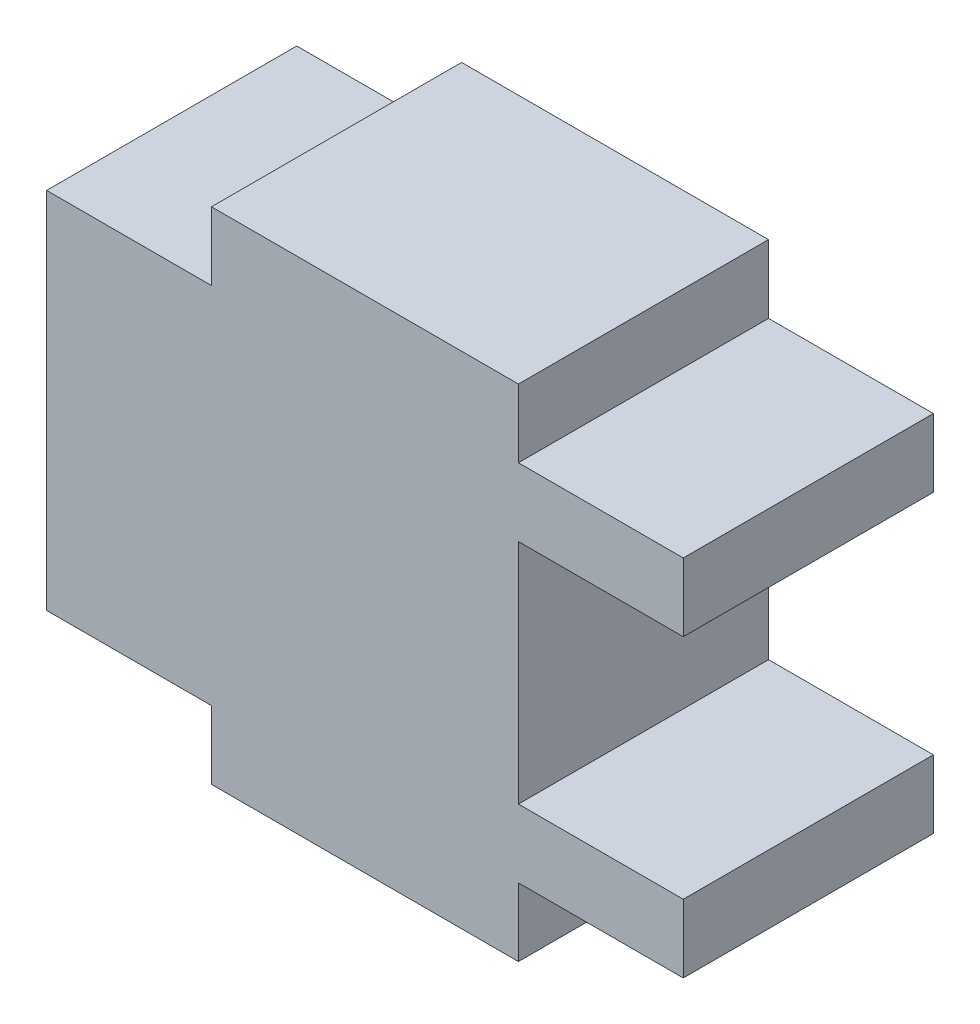
ISO-10303-21;
HEADER;
FILE_DESCRIPTION(('STEP AP214'),'2;1');
FILE_NAME('part.step','',(''),(''),'','','');
FILE_SCHEMA(('AUTOMOTIVE_DESIGN { 1 0 10303 214 1 1 1 1 }'));
ENDSEC;
DATA;
#1=APPLICATION_CONTEXT('core data for automotive mechanical design processes');
#2=APPLICATION_PROTOCOL_DEFINITION('international standard','automotive_design',2000,#1);
#3=PRODUCT_CONTEXT('',#1,'mechanical');
#4=PRODUCT('Part','Part','',(#3));
#5=PRODUCT_RELATED_PRODUCT_CATEGORY('part','',(#4));
#6=PRODUCT_DEFINITION_FORMATION('','',#4);
#7=PRODUCT_DEFINITION_CONTEXT('part definition',#1,'design');
#8=PRODUCT_DEFINITION('design','',#6,#7);
#9=PRODUCT_DEFINITION_SHAPE('','',#8);
#10=(LENGTH_UNIT() NAMED_UNIT(*) SI_UNIT(.MILLI.,.METRE.));
#11=(NAMED_UNIT(*) PLANE_ANGLE_UNIT() SI_UNIT($,.RADIAN.));
#12=(NAMED_UNIT(*) SI_UNIT($,.STERADIAN.) SOLID_ANGLE_UNIT());
#13=UNCERTAINTY_MEASURE_WITH_UNIT(LENGTH_MEASURE(1.E-05),#10,'distance_accuracy_value','');
#14=(GEOMETRIC_REPRESENTATION_CONTEXT(3) GLOBAL_UNCERTAINTY_ASSIGNED_CONTEXT((#13)) GLOBAL_UNIT_ASSIGNED_CONTEXT((#10,
#11,#12)) REPRESENTATION_CONTEXT('',''));
#15=CARTESIAN_POINT('',(0.,0.,0.));
#16=DIRECTION('',(0.,0.,1.));
#17=DIRECTION('',(1.,0.,0.));
#18=AXIS2_PLACEMENT_3D('',#15,#16,#17);
#19=CARTESIAN_POINT('',(-1.4,0.8,1.1));
#20=DIRECTION('',(1.,0.,0.));
#21=DIRECTION('',(0.,0.,-1.));
#22=AXIS2_PLACEMENT_3D('',#19,#20,#21);
#23=PLANE('',#22);
#24=DIRECTION('',(0.,-1.,0.));
#25=VECTOR('',#24,1.);
#26=CARTESIAN_POINT('',(-1.4,0.8,0.));
#27=LINE('',#26,#25);
#28=CARTESIAN_POINT('',(-1.4,0.8,0.));
#29=VERTEX_POINT('',#28);
#30=CARTESIAN_POINT('',(-1.4,-0.8,0.));
#31=VERTEX_POINT('',#30);
#32=EDGE_CURVE('E178',#29,#31,#27,.T.);
#33=ORIENTED_EDGE('',*,*,#32,.T.);
#34=DIRECTION('',(0.,0.,-1.));
#35=VECTOR('',#34,1.);
#36=CARTESIAN_POINT('',(-1.4,-0.8,1.1));
#37=LINE('',#36,#35);
#38=CARTESIAN_POINT('',(-1.4,-0.8,1.1));
#39=VERTEX_POINT('',#38);
#40=EDGE_CURVE('E11',#39,#31,#37,.T.);
#41=ORIENTED_EDGE('',*,*,#40,.F.);
#42=DIRECTION('',(0.,-1.,0.));
#43=VECTOR('',#42,1.);
#44=CARTESIAN_POINT('',(-1.4,0.8,1.1));
#45=LINE('',#44,#43);
#46=CARTESIAN_POINT('',(-1.4,0.8,1.1));
#47=VERTEX_POINT('',#46);
#48=EDGE_CURVE('E208',#47,#39,#45,.T.);
#49=ORIENTED_EDGE('',*,*,#48,.F.);
#50=DIRECTION('',(0.,0.,-1.));
#51=VECTOR('',#50,1.);
#52=CARTESIAN_POINT('',(-1.4,0.8,1.1));
#53=LINE('',#52,#51);
#54=EDGE_CURVE('E174',#47,#29,#53,.T.);
#55=ORIENTED_EDGE('',*,*,#54,.T.);
#56=EDGE_LOOP('',(#33,#41,#49,#55));
#57=FACE_BOUND('',#56,.T.);
#58=ADVANCED_FACE('F34',(#57),#23,.F.);
#59=CARTESIAN_POINT('',(-1.4,-0.8,1.1));
#60=DIRECTION('',(0.,1.,0.));
#61=DIRECTION('',(0.,0.,1.));
#62=AXIS2_PLACEMENT_3D('',#59,#60,#61);
#63=PLANE('',#62);
#64=DIRECTION('',(1.,0.,0.));
#65=VECTOR('',#64,1.);
#66=CARTESIAN_POINT('',(-1.4,-0.8,0.));
#67=LINE('',#66,#65);
#68=CARTESIAN_POINT('',(-0.675,-0.8,0.));
#69=VERTEX_POINT('',#68);
#70=EDGE_CURVE('E181',#31,#69,#67,.T.);
#71=ORIENTED_EDGE('',*,*,#70,.T.);
#72=DIRECTION('',(0.,0.,-1.));
#73=VECTOR('',#72,1.);
#74=CARTESIAN_POINT('',(-0.675,-0.8,1.1));
#75=LINE('',#74,#73);
#76=CARTESIAN_POINT('',(-0.675,-0.8,1.1));
#77=VERTEX_POINT('',#76);
#78=EDGE_CURVE('E42',#77,#69,#75,.T.);
#79=ORIENTED_EDGE('',*,*,#78,.F.);
#80=DIRECTION('',(1.,0.,0.));
#81=VECTOR('',#80,1.);
#82=CARTESIAN_POINT('',(-1.4,-0.8,1.1));
#83=LINE('',#82,#81);
#84=EDGE_CURVE('E117',#39,#77,#83,.T.);
#85=ORIENTED_EDGE('',*,*,#84,.F.);
#86=ORIENTED_EDGE('',*,*,#40,.T.);
#87=EDGE_LOOP('',(#71,#79,#85,#86));
#88=FACE_BOUND('',#87,.T.);
#89=ADVANCED_FACE('F306',(#88),#63,.F.);
#90=CARTESIAN_POINT('',(-0.675,-0.8,1.1));
#91=DIRECTION('',(1.,0.,0.));
#92=DIRECTION('',(0.,0.,-1.));
#93=AXIS2_PLACEMENT_3D('',#90,#91,#92);
#94=PLANE('',#93);
#95=DIRECTION('',(0.,-1.,0.));
#96=VECTOR('',#95,1.);
#97=CARTESIAN_POINT('',(-0.675,-0.8,0.));
#98=LINE('',#97,#96);
#99=CARTESIAN_POINT('',(-0.675,-1.1,0.));
#100=VERTEX_POINT('',#99);
#101=EDGE_CURVE('E183',#69,#100,#98,.T.);
#102=ORIENTED_EDGE('',*,*,#101,.T.);
#103=DIRECTION('',(0.,0.,-1.));
#104=VECTOR('',#103,1.);
#105=CARTESIAN_POINT('',(-0.675,-1.1,1.1));
#106=LINE('',#105,#104);
#107=CARTESIAN_POINT('',(-0.675,-1.1,1.1));
#108=VERTEX_POINT('',#107);
#109=EDGE_CURVE('E239',#108,#100,#106,.T.);
#110=ORIENTED_EDGE('',*,*,#109,.F.);
#111=DIRECTION('',(0.,-1.,0.));
#112=VECTOR('',#111,1.);
#113=CARTESIAN_POINT('',(-0.675,-0.8,1.1));
#114=LINE('',#113,#112);
#115=EDGE_CURVE('E247',#77,#108,#114,.T.);
#116=ORIENTED_EDGE('',*,*,#115,.F.);
#117=ORIENTED_EDGE('',*,*,#78,.T.);
#118=EDGE_LOOP('',(#102,#110,#116,#117));
#119=FACE_BOUND('',#118,.T.);
#120=ADVANCED_FACE('F245',(#119),#94,.F.);
#121=CARTESIAN_POINT('',(-0.675,-1.1,1.1));
#122=DIRECTION('',(0.,1.,0.));
#123=DIRECTION('',(0.,0.,1.));
#124=AXIS2_PLACEMENT_3D('',#121,#122,#123);
#125=PLANE('',#124);
#126=DIRECTION('',(1.,0.,0.));
#127=VECTOR('',#126,1.);
#128=CARTESIAN_POINT('',(-0.675,-1.1,0.));
#129=LINE('',#128,#127);
#130=CARTESIAN_POINT('',(0.675,-1.1,0.));
#131=VERTEX_POINT('',#130);
#132=EDGE_CURVE('E185',#100,#131,#129,.T.);
#133=ORIENTED_EDGE('',*,*,#132,.T.);
#134=DIRECTION('',(0.,0.,-1.));
#135=VECTOR('',#134,1.);
#136=CARTESIAN_POINT('',(0.675,-1.1,1.1));
#137=LINE('',#136,#135);
#138=CARTESIAN_POINT('',(0.675,-1.1,1.1));
#139=VERTEX_POINT('',#138);
#140=EDGE_CURVE('E236',#139,#131,#137,.T.);
#141=ORIENTED_EDGE('',*,*,#140,.F.);
#142=DIRECTION('',(1.,0.,0.));
#143=VECTOR('',#142,1.);
#144=CARTESIAN_POINT('',(-0.675,-1.1,1.1));
#145=LINE('',#144,#143);
#146=EDGE_CURVE('E265',#108,#139,#145,.T.);
#147=ORIENTED_EDGE('',*,*,#146,.F.);
#148=ORIENTED_EDGE('',*,*,#109,.T.);
#149=EDGE_LOOP('',(#133,#141,#147,#148));
#150=FACE_BOUND('',#149,.T.);
#151=ADVANCED_FACE('F256',(#150),#125,.F.);
#152=CARTESIAN_POINT('',(0.675,-1.1,1.1));
#153=DIRECTION('',(-1.,0.,0.));
#154=DIRECTION('',(0.,0.,1.));
#155=AXIS2_PLACEMENT_3D('',#152,#153,#154);
#156=PLANE('',#155);
#157=DIRECTION('',(0.,1.,0.));
#158=VECTOR('',#157,1.);
#159=CARTESIAN_POINT('',(0.675,-1.1,0.));
#160=LINE('',#159,#158);
#161=CARTESIAN_POINT('',(0.675,-0.8,0.));
#162=VERTEX_POINT('',#161);
#163=EDGE_CURVE('E187',#131,#162,#160,.T.);
#164=ORIENTED_EDGE('',*,*,#163,.T.);
#165=DIRECTION('',(0.,0.,-1.));
#166=VECTOR('',#165,1.);
#167=CARTESIAN_POINT('',(0.675,-0.8,1.1));
#168=LINE('',#167,#166);
#169=CARTESIAN_POINT('',(0.675,-0.8,1.1));
#170=VERTEX_POINT('',#169);
#171=EDGE_CURVE('E233',#170,#162,#168,.T.);
#172=ORIENTED_EDGE('',*,*,#171,.F.);
#173=DIRECTION('',(0.,1.,0.));
#174=VECTOR('',#173,1.);
#175=CARTESIAN_POINT('',(0.675,-1.1,1.1));
#176=LINE('',#175,#174);
#177=EDGE_CURVE('E262',#139,#170,#176,.T.);
#178=ORIENTED_EDGE('',*,*,#177,.F.);
#179=ORIENTED_EDGE('',*,*,#140,.T.);
#180=EDGE_LOOP('',(#164,#172,#178,#179));
#181=FACE_BOUND('',#180,.T.);
#182=ADVANCED_FACE('F260',(#181),#156,.F.);
#183=CARTESIAN_POINT('',(0.675,-0.8,1.1));
#184=DIRECTION('',(0.,1.,0.));
#185=DIRECTION('',(0.,0.,1.));
#186=AXIS2_PLACEMENT_3D('',#183,#184,#185);
#187=PLANE('',#186);
#188=DIRECTION('',(1.,0.,0.));
#189=VECTOR('',#188,1.);
#190=CARTESIAN_POINT('',(0.675,-0.8,0.));
#191=LINE('',#190,#189);
#192=CARTESIAN_POINT('',(1.4,-0.8,0.));
#193=VERTEX_POINT('',#192);
#194=EDGE_CURVE('E189',#162,#193,#191,.T.);
#195=ORIENTED_EDGE('',*,*,#194,.T.);
#196=DIRECTION('',(0.,0.,-1.));
#197=VECTOR('',#196,1.);
#198=CARTESIAN_POINT('',(1.4,-0.8,1.1));
#199=LINE('',#198,#197);
#200=CARTESIAN_POINT('',(1.4,-0.8,1.1));
#201=VERTEX_POINT('',#200);
#202=EDGE_CURVE('E230',#201,#193,#199,.T.);
#203=ORIENTED_EDGE('',*,*,#202,.F.);
#204=DIRECTION('',(1.,0.,0.));
#205=VECTOR('',#204,1.);
#206=CARTESIAN_POINT('',(0.675,-0.8,1.1));
#207=LINE('',#206,#205);
#208=EDGE_CURVE('E264',#170,#201,#207,.T.);
#209=ORIENTED_EDGE('',*,*,#208,.F.);
#210=ORIENTED_EDGE('',*,*,#171,.T.);
#211=EDGE_LOOP('',(#195,#203,#209,#210));
#212=FACE_BOUND('',#211,.T.);
#213=ADVANCED_FACE('F319',(#212),#187,.F.);
#214=CARTESIAN_POINT('',(1.4,-0.8,1.1));
#215=DIRECTION('',(-1.,0.,0.));
#216=DIRECTION('',(0.,0.,1.));
#217=AXIS2_PLACEMENT_3D('',#214,#215,#216);
#218=PLANE('',#217);
#219=DIRECTION('',(0.,1.,0.));
#220=VECTOR('',#219,1.);
#221=CARTESIAN_POINT('',(1.4,-0.8,0.));
#222=LINE('',#221,#220);
#223=CARTESIAN_POINT('',(1.4,-0.5,0.));
#224=VERTEX_POINT('',#223);
#225=EDGE_CURVE('E191',#193,#224,#222,.T.);
#226=ORIENTED_EDGE('',*,*,#225,.T.);
#227=DIRECTION('',(0.,0.,-1.));
#228=VECTOR('',#227,1.);
#229=CARTESIAN_POINT('',(1.4,-0.5,1.1));
#230=LINE('',#229,#228);
#231=CARTESIAN_POINT('',(1.4,-0.5,1.1));
#232=VERTEX_POINT('',#231);
#233=EDGE_CURVE('E227',#232,#224,#230,.T.);
#234=ORIENTED_EDGE('',*,*,#233,.F.);
#235=DIRECTION('',(0.,1.,0.));
#236=VECTOR('',#235,1.);
#237=CARTESIAN_POINT('',(1.4,-0.8,1.1));
#238=LINE('',#237,#236);
#239=EDGE_CURVE('E267',#201,#232,#238,.T.);
#240=ORIENTED_EDGE('',*,*,#239,.F.);
#241=ORIENTED_EDGE('',*,*,#202,.T.);
#242=EDGE_LOOP('',(#226,#234,#240,#241));
#243=FACE_BOUND('',#242,.T.);
#244=ADVANCED_FACE('F322',(#243),#218,.F.);
#245=CARTESIAN_POINT('',(1.4,-0.5,1.1));
#246=DIRECTION('',(0.,-1.,0.));
#247=DIRECTION('',(0.,0.,-1.));
#248=AXIS2_PLACEMENT_3D('',#245,#246,#247);
#249=PLANE('',#248);
#250=DIRECTION('',(-1.,0.,0.));
#251=VECTOR('',#250,1.);
#252=CARTESIAN_POINT('',(1.4,-0.5,0.));
#253=LINE('',#252,#251);
#254=CARTESIAN_POINT('',(0.675,-0.5,0.));
#255=VERTEX_POINT('',#254);
#256=EDGE_CURVE('E193',#224,#255,#253,.T.);
#257=ORIENTED_EDGE('',*,*,#256,.T.);
#258=DIRECTION('',(0.,0.,-1.));
#259=VECTOR('',#258,1.);
#260=CARTESIAN_POINT('',(0.675,-0.5,1.1));
#261=LINE('',#260,#259);
#262=CARTESIAN_POINT('',(0.675,-0.5,1.1));
#263=VERTEX_POINT('',#262);
#264=EDGE_CURVE('E224',#263,#255,#261,.T.);
#265=ORIENTED_EDGE('',*,*,#264,.F.);
#266=DIRECTION('',(-1.,0.,0.));
#267=VECTOR('',#266,1.);
#268=CARTESIAN_POINT('',(1.4,-0.5,1.1));
#269=LINE('',#268,#267);
#270=EDGE_CURVE('E273',#232,#263,#269,.T.);
#271=ORIENTED_EDGE('',*,*,#270,.F.);
#272=ORIENTED_EDGE('',*,*,#233,.T.);
#273=EDGE_LOOP('',(#257,#265,#271,#272));
#274=FACE_BOUND('',#273,.T.);
#275=ADVANCED_FACE('F326',(#274),#249,.F.);
#276=CARTESIAN_POINT('',(0.675,-0.5,1.1));
#277=DIRECTION('',(-1.,0.,0.));
#278=DIRECTION('',(0.,0.,1.));
#279=AXIS2_PLACEMENT_3D('',#276,#277,#278);
#280=PLANE('',#279);
#281=DIRECTION('',(0.,1.,0.));
#282=VECTOR('',#281,1.);
#283=CARTESIAN_POINT('',(0.675,-0.5,0.));
#284=LINE('',#283,#282);
#285=CARTESIAN_POINT('',(0.675,0.5,0.));
#286=VERTEX_POINT('',#285);
#287=EDGE_CURVE('E195',#255,#286,#284,.T.);
#288=ORIENTED_EDGE('',*,*,#287,.T.);
#289=DIRECTION('',(0.,0.,-1.));
#290=VECTOR('',#289,1.);
#291=CARTESIAN_POINT('',(0.675,0.5,1.1));
#292=LINE('',#291,#290);
#293=CARTESIAN_POINT('',(0.675,0.5,1.1));
#294=VERTEX_POINT('',#293);
#295=EDGE_CURVE('E221',#294,#286,#292,.T.);
#296=ORIENTED_EDGE('',*,*,#295,.F.);
#297=DIRECTION('',(0.,1.,0.));
#298=VECTOR('',#297,1.);
#299=CARTESIAN_POINT('',(0.675,-0.5,1.1));
#300=LINE('',#299,#298);
#301=EDGE_CURVE('E275',#263,#294,#300,.T.);
#302=ORIENTED_EDGE('',*,*,#301,.F.);
#303=ORIENTED_EDGE('',*,*,#264,.T.);
#304=EDGE_LOOP('',(#288,#296,#302,#303));
#305=FACE_BOUND('',#304,.T.);
#306=ADVANCED_FACE('F330',(#305),#280,.F.);
#307=CARTESIAN_POINT('',(0.675,0.5,1.1));
#308=DIRECTION('',(0.,1.,0.));
#309=DIRECTION('',(0.,0.,1.));
#310=AXIS2_PLACEMENT_3D('',#307,#308,#309);
#311=PLANE('',#310);
#312=DIRECTION('',(1.,0.,0.));
#313=VECTOR('',#312,1.);
#314=CARTESIAN_POINT('',(0.675,0.5,0.));
#315=LINE('',#314,#313);
#316=CARTESIAN_POINT('',(1.4,0.5,0.));
#317=VERTEX_POINT('',#316);
#318=EDGE_CURVE('E197',#286,#317,#315,.T.);
#319=ORIENTED_EDGE('',*,*,#318,.T.);
#320=DIRECTION('',(0.,0.,-1.));
#321=VECTOR('',#320,1.);
#322=CARTESIAN_POINT('',(1.4,0.5,1.1));
#323=LINE('',#322,#321);
#324=CARTESIAN_POINT('',(1.4,0.5,1.1));
#325=VERTEX_POINT('',#324);
#326=EDGE_CURVE('E218',#325,#317,#323,.T.);
#327=ORIENTED_EDGE('',*,*,#326,.F.);
#328=DIRECTION('',(1.,0.,0.));
#329=VECTOR('',#328,1.);
#330=CARTESIAN_POINT('',(0.675,0.5,1.1));
#331=LINE('',#330,#329);
#332=EDGE_CURVE('E277',#294,#325,#331,.T.);
#333=ORIENTED_EDGE('',*,*,#332,.F.);
#334=ORIENTED_EDGE('',*,*,#295,.T.);
#335=EDGE_LOOP('',(#319,#327,#333,#334));
#336=FACE_BOUND('',#335,.T.);
#337=ADVANCED_FACE('F334',(#336),#311,.F.);
#338=CARTESIAN_POINT('',(1.4,0.5,1.1));
#339=DIRECTION('',(-1.,0.,0.));
#340=DIRECTION('',(0.,0.,1.));
#341=AXIS2_PLACEMENT_3D('',#338,#339,#340);
#342=PLANE('',#341);
#343=DIRECTION('',(0.,1.,0.));
#344=VECTOR('',#343,1.);
#345=CARTESIAN_POINT('',(1.4,0.5,0.));
#346=LINE('',#345,#344);
#347=CARTESIAN_POINT('',(1.4,0.8,0.));
#348=VERTEX_POINT('',#347);
#349=EDGE_CURVE('E199',#317,#348,#346,.T.);
#350=ORIENTED_EDGE('',*,*,#349,.T.);
#351=DIRECTION('',(0.,0.,-1.));
#352=VECTOR('',#351,1.);
#353=CARTESIAN_POINT('',(1.4,0.8,1.1));
#354=LINE('',#353,#352);
#355=CARTESIAN_POINT('',(1.4,0.8,1.1));
#356=VERTEX_POINT('',#355);
#357=EDGE_CURVE('E215',#356,#348,#354,.T.);
#358=ORIENTED_EDGE('',*,*,#357,.F.);
#359=DIRECTION('',(0.,1.,0.));
#360=VECTOR('',#359,1.);
#361=CARTESIAN_POINT('',(1.4,0.5,1.1));
#362=LINE('',#361,#360);
#363=EDGE_CURVE('E279',#325,#356,#362,.T.);
#364=ORIENTED_EDGE('',*,*,#363,.F.);
#365=ORIENTED_EDGE('',*,*,#326,.T.);
#366=EDGE_LOOP('',(#350,#358,#364,#365));
#367=FACE_BOUND('',#366,.T.);
#368=ADVANCED_FACE('F338',(#367),#342,.F.);
#369=CARTESIAN_POINT('',(1.4,0.8,1.1));
#370=DIRECTION('',(0.,-1.,0.));
#371=DIRECTION('',(0.,0.,-1.));
#372=AXIS2_PLACEMENT_3D('',#369,#370,#371);
#373=PLANE('',#372);
#374=DIRECTION('',(-1.,0.,0.));
#375=VECTOR('',#374,1.);
#376=CARTESIAN_POINT('',(1.4,0.8,0.));
#377=LINE('',#376,#375);
#378=CARTESIAN_POINT('',(0.675,0.8,0.));
#379=VERTEX_POINT('',#378);
#380=EDGE_CURVE('E201',#348,#379,#377,.T.);
#381=ORIENTED_EDGE('',*,*,#380,.T.);
#382=DIRECTION('',(0.,0.,-1.));
#383=VECTOR('',#382,1.);
#384=CARTESIAN_POINT('',(0.675,0.8,1.1));
#385=LINE('',#384,#383);
#386=CARTESIAN_POINT('',(0.675,0.8,1.1));
#387=VERTEX_POINT('',#386);
#388=EDGE_CURVE('E212',#387,#379,#385,.T.);
#389=ORIENTED_EDGE('',*,*,#388,.F.);
#390=DIRECTION('',(-1.,0.,0.));
#391=VECTOR('',#390,1.);
#392=CARTESIAN_POINT('',(1.4,0.8,1.1));
#393=LINE('',#392,#391);
#394=EDGE_CURVE('E281',#356,#387,#393,.T.);
#395=ORIENTED_EDGE('',*,*,#394,.F.);
#396=ORIENTED_EDGE('',*,*,#357,.T.);
#397=EDGE_LOOP('',(#381,#389,#395,#396));
#398=FACE_BOUND('',#397,.T.);
#399=ADVANCED_FACE('F287',(#398),#373,.F.);
#400=CARTESIAN_POINT('',(0.675,0.8,1.1));
#401=DIRECTION('',(-1.,0.,0.));
#402=DIRECTION('',(0.,0.,1.));
#403=AXIS2_PLACEMENT_3D('',#400,#401,#402);
#404=PLANE('',#403);
#405=DIRECTION('',(0.,1.,0.));
#406=VECTOR('',#405,1.);
#407=CARTESIAN_POINT('',(0.675,0.8,0.));
#408=LINE('',#407,#406);
#409=CARTESIAN_POINT('',(0.675,1.1,0.));
#410=VERTEX_POINT('',#409);
#411=EDGE_CURVE('E203',#379,#410,#408,.T.);
#412=ORIENTED_EDGE('',*,*,#411,.T.);
#413=DIRECTION('',(0.,0.,-1.));
#414=VECTOR('',#413,1.);
#415=CARTESIAN_POINT('',(0.675,1.1,1.1));
#416=LINE('',#415,#414);
#417=CARTESIAN_POINT('',(0.675,1.1,1.1));
#418=VERTEX_POINT('',#417);
#419=EDGE_CURVE('E169',#418,#410,#416,.T.);
#420=ORIENTED_EDGE('',*,*,#419,.F.);
#421=DIRECTION('',(0.,1.,0.));
#422=VECTOR('',#421,1.);
#423=CARTESIAN_POINT('',(0.675,0.8,1.1));
#424=LINE('',#423,#422);
#425=EDGE_CURVE('E160',#387,#418,#424,.T.);
#426=ORIENTED_EDGE('',*,*,#425,.F.);
#427=ORIENTED_EDGE('',*,*,#388,.T.);
#428=EDGE_LOOP('',(#412,#420,#426,#427));
#429=FACE_BOUND('',#428,.T.);
#430=ADVANCED_FACE('F291',(#429),#404,.F.);
#431=CARTESIAN_POINT('',(0.675,1.1,1.1));
#432=DIRECTION('',(0.,-1.,0.));
#433=DIRECTION('',(0.,0.,-1.));
#434=AXIS2_PLACEMENT_3D('',#431,#432,#433);
#435=PLANE('',#434);
#436=DIRECTION('',(-1.,0.,0.));
#437=VECTOR('',#436,1.);
#438=CARTESIAN_POINT('',(0.675,1.1,0.));
#439=LINE('',#438,#437);
#440=CARTESIAN_POINT('',(-0.675,1.1,0.));
#441=VERTEX_POINT('',#440);
#442=EDGE_CURVE('E168',#410,#441,#439,.T.);
#443=ORIENTED_EDGE('',*,*,#442,.T.);
#444=DIRECTION('',(0.,0.,-1.));
#445=VECTOR('',#444,1.);
#446=CARTESIAN_POINT('',(-0.675,1.1,1.1));
#447=LINE('',#446,#445);
#448=CARTESIAN_POINT('',(-0.675,1.1,1.1));
#449=VERTEX_POINT('',#448);
#450=EDGE_CURVE('E165',#449,#441,#447,.T.);
#451=ORIENTED_EDGE('',*,*,#450,.F.);
#452=DIRECTION('',(-1.,0.,0.));
#453=VECTOR('',#452,1.);
#454=CARTESIAN_POINT('',(0.675,1.1,1.1));
#455=LINE('',#454,#453);
#456=EDGE_CURVE('E154',#418,#449,#455,.T.);
#457=ORIENTED_EDGE('',*,*,#456,.F.);
#458=ORIENTED_EDGE('',*,*,#419,.T.);
#459=EDGE_LOOP('',(#443,#451,#457,#458));
#460=FACE_BOUND('',#459,.T.);
#461=ADVANCED_FACE('F166',(#460),#435,.F.);
#462=CARTESIAN_POINT('',(-0.675,1.1,1.1));
#463=DIRECTION('',(1.,0.,0.));
#464=DIRECTION('',(0.,0.,-1.));
#465=AXIS2_PLACEMENT_3D('',#462,#463,#464);
#466=PLANE('',#465);
#467=DIRECTION('',(0.,-1.,0.));
#468=VECTOR('',#467,1.);
#469=CARTESIAN_POINT('',(-0.675,1.1,0.));
#470=LINE('',#469,#468);
#471=CARTESIAN_POINT('',(-0.675,0.8,0.));
#472=VERTEX_POINT('',#471);
#473=EDGE_CURVE('E103',#441,#472,#470,.T.);
#474=ORIENTED_EDGE('',*,*,#473,.T.);
#475=DIRECTION('',(0.,0.,-1.));
#476=VECTOR('',#475,1.);
#477=CARTESIAN_POINT('',(-0.675,0.8,1.1));
#478=LINE('',#477,#476);
#479=CARTESIAN_POINT('',(-0.675,0.8,1.1));
#480=VERTEX_POINT('',#479);
#481=EDGE_CURVE('E170',#480,#472,#478,.T.);
#482=ORIENTED_EDGE('',*,*,#481,.F.);
#483=DIRECTION('',(0.,-1.,0.));
#484=VECTOR('',#483,1.);
#485=CARTESIAN_POINT('',(-0.675,1.1,1.1));
#486=LINE('',#485,#484);
#487=EDGE_CURVE('E158',#449,#480,#486,.T.);
#488=ORIENTED_EDGE('',*,*,#487,.F.);
#489=ORIENTED_EDGE('',*,*,#450,.T.);
#490=EDGE_LOOP('',(#474,#482,#488,#489));
#491=FACE_BOUND('',#490,.T.);
#492=ADVANCED_FACE('F172',(#491),#466,.F.);
#493=CARTESIAN_POINT('',(-0.675,0.8,1.1));
#494=DIRECTION('',(0.,-1.,0.));
#495=DIRECTION('',(0.,0.,-1.));
#496=AXIS2_PLACEMENT_3D('',#493,#494,#495);
#497=PLANE('',#496);
#498=DIRECTION('',(-1.,0.,0.));
#499=VECTOR('',#498,1.);
#500=CARTESIAN_POINT('',(-0.675,0.8,0.));
#501=LINE('',#500,#499);
#502=EDGE_CURVE('E109',#472,#29,#501,.T.);
#503=ORIENTED_EDGE('',*,*,#502,.T.);
#504=ORIENTED_EDGE('',*,*,#54,.F.);
#505=DIRECTION('',(-1.,0.,0.));
#506=VECTOR('',#505,1.);
#507=CARTESIAN_POINT('',(-0.675,0.8,1.1));
#508=LINE('',#507,#506);
#509=EDGE_CURVE('E50',#480,#47,#508,.T.);
#510=ORIENTED_EDGE('',*,*,#509,.F.);
#511=ORIENTED_EDGE('',*,*,#481,.T.);
#512=EDGE_LOOP('',(#503,#504,#510,#511));
#513=FACE_BOUND('',#512,.T.);
#514=ADVANCED_FACE('F295',(#513),#497,.F.);
#515=CARTESIAN_POINT('',(0.,0.,1.1));
#516=DIRECTION('',(0.,0.,1.));
#517=DIRECTION('',(1.,0.,0.));
#518=AXIS2_PLACEMENT_3D('',#515,#516,#517);
#519=PLANE('',#518);
#520=ORIENTED_EDGE('',*,*,#48,.T.);
#521=ORIENTED_EDGE('',*,*,#84,.T.);
#522=ORIENTED_EDGE('',*,*,#115,.T.);
#523=ORIENTED_EDGE('',*,*,#146,.T.);
#524=ORIENTED_EDGE('',*,*,#177,.T.);
#525=ORIENTED_EDGE('',*,*,#208,.T.);
#526=ORIENTED_EDGE('',*,*,#239,.T.);
#527=ORIENTED_EDGE('',*,*,#270,.T.);
#528=ORIENTED_EDGE('',*,*,#301,.T.);
#529=ORIENTED_EDGE('',*,*,#332,.T.);
#530=ORIENTED_EDGE('',*,*,#363,.T.);
#531=ORIENTED_EDGE('',*,*,#394,.T.);
#532=ORIENTED_EDGE('',*,*,#425,.T.);
#533=ORIENTED_EDGE('',*,*,#456,.T.);
#534=ORIENTED_EDGE('',*,*,#487,.T.);
#535=ORIENTED_EDGE('',*,*,#509,.T.);
#536=EDGE_LOOP('',(#520,#521,#522,#523,#524,#525,#526,#527,#528,#529,#530,#531,#532,#533,#534,#535));
#537=FACE_BOUND('',#536,.T.);
#538=ADVANCED_FACE('F156',(#537),#519,.T.);
#539=CARTESIAN_POINT('',(0.,0.,0.));
#540=DIRECTION('',(0.,0.,1.));
#541=DIRECTION('',(1.,0.,0.));
#542=AXIS2_PLACEMENT_3D('',#539,#540,#541);
#543=PLANE('',#542);
#544=ORIENTED_EDGE('',*,*,#32,.F.);
#545=ORIENTED_EDGE('',*,*,#502,.F.);
#546=ORIENTED_EDGE('',*,*,#473,.F.);
#547=ORIENTED_EDGE('',*,*,#442,.F.);
#548=ORIENTED_EDGE('',*,*,#411,.F.);
#549=ORIENTED_EDGE('',*,*,#380,.F.);
#550=ORIENTED_EDGE('',*,*,#349,.F.);
#551=ORIENTED_EDGE('',*,*,#318,.F.);
#552=ORIENTED_EDGE('',*,*,#287,.F.);
#553=ORIENTED_EDGE('',*,*,#256,.F.);
#554=ORIENTED_EDGE('',*,*,#225,.F.);
#555=ORIENTED_EDGE('',*,*,#194,.F.);
#556=ORIENTED_EDGE('',*,*,#163,.F.);
#557=ORIENTED_EDGE('',*,*,#132,.F.);
#558=ORIENTED_EDGE('',*,*,#101,.F.);
#559=ORIENTED_EDGE('',*,*,#70,.F.);
#560=EDGE_LOOP('',(#544,#545,#546,#547,#548,#549,#550,#551,#552,#553,#554,#555,#556,#557,#558,#559));
#561=FACE_BOUND('',#560,.T.);
#562=ADVANCED_FACE('F251',(#561),#543,.F.);
#563=CLOSED_SHELL('',(#58,#89,#120,#151,#182,#213,#244,#275,#306,#337,#368,#399,#430,#461,#492,
#514,#538,#562));
#564=MANIFOLD_SOLID_BREP('B2',#563);
#565=ADVANCED_BREP_SHAPE_REPRESENTATION('',(#18,#564),#14);
#566=SHAPE_DEFINITION_REPRESENTATION(#9,#565);
ENDSEC;
END-ISO-10303-21;
